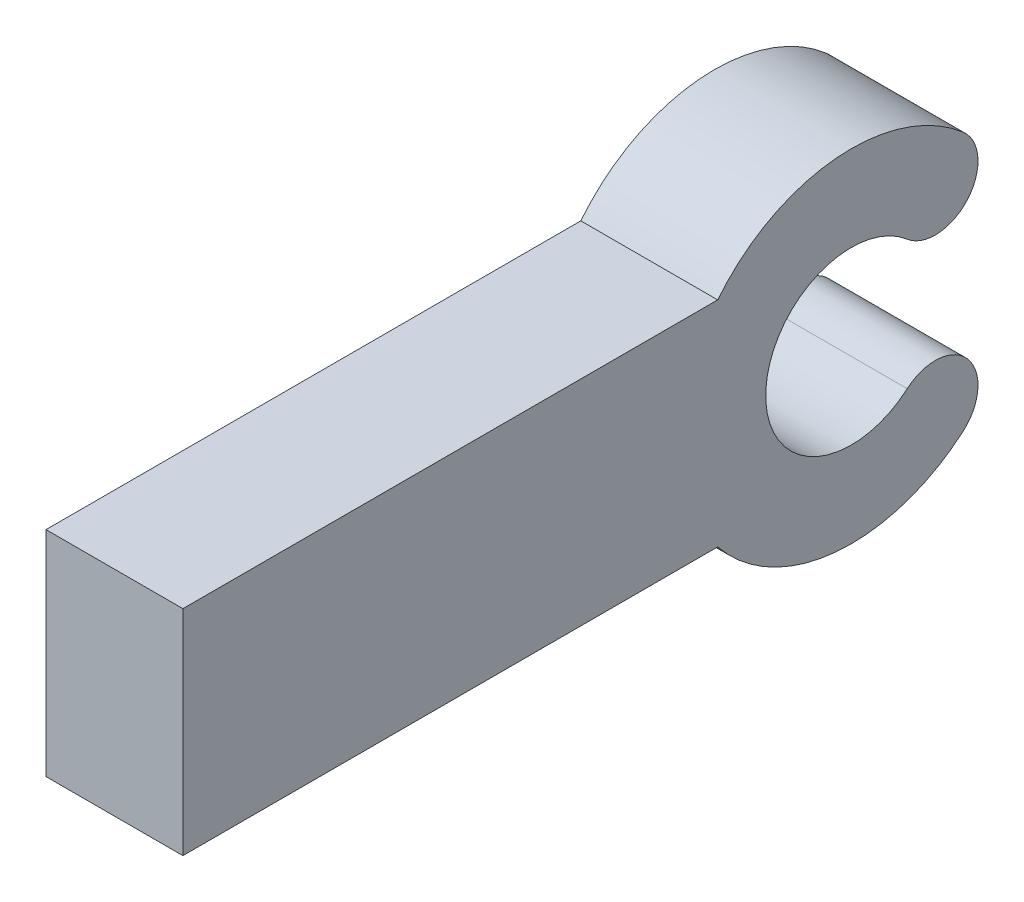
ISO-10303-21;
HEADER;
FILE_DESCRIPTION(('STEP AP214'),'2;1');
FILE_NAME('part.step','',(''),(''),'','','');
FILE_SCHEMA(('AUTOMOTIVE_DESIGN { 1 0 10303 214 1 1 1 1 }'));
ENDSEC;
DATA;
#1=APPLICATION_CONTEXT('core data for automotive mechanical design processes');
#2=APPLICATION_PROTOCOL_DEFINITION('international standard','automotive_design',2000,#1);
#3=PRODUCT_CONTEXT('',#1,'mechanical');
#4=PRODUCT('Part','Part','',(#3));
#5=PRODUCT_RELATED_PRODUCT_CATEGORY('part','',(#4));
#6=PRODUCT_DEFINITION_FORMATION('','',#4);
#7=PRODUCT_DEFINITION_CONTEXT('part definition',#1,'design');
#8=PRODUCT_DEFINITION('design','',#6,#7);
#9=PRODUCT_DEFINITION_SHAPE('','',#8);
#10=(LENGTH_UNIT() NAMED_UNIT(*) SI_UNIT(.MILLI.,.METRE.));
#11=(NAMED_UNIT(*) PLANE_ANGLE_UNIT() SI_UNIT($,.RADIAN.));
#12=(NAMED_UNIT(*) SI_UNIT($,.STERADIAN.) SOLID_ANGLE_UNIT());
#13=UNCERTAINTY_MEASURE_WITH_UNIT(LENGTH_MEASURE(1.E-05),#10,'distance_accuracy_value','');
#14=(GEOMETRIC_REPRESENTATION_CONTEXT(3) GLOBAL_UNCERTAINTY_ASSIGNED_CONTEXT((#13)) GLOBAL_UNIT_ASSIGNED_CONTEXT((#10,
#11,#12)) REPRESENTATION_CONTEXT('',''));
#15=CARTESIAN_POINT('',(0.,0.,0.));
#16=DIRECTION('',(0.,0.,1.));
#17=DIRECTION('',(1.,0.,0.));
#18=AXIS2_PLACEMENT_3D('',#15,#16,#17);
#19=CARTESIAN_POINT('',(1.6256,0.,0.));
#20=DIRECTION('',(0.,0.,-1.));
#21=DIRECTION('',(-1.,0.,0.));
#22=AXIS2_PLACEMENT_3D('',#19,#20,#21);
#23=PLANE('',#22);
#24=DIRECTION('',(0.,-1.,0.));
#25=VECTOR('',#24,1.);
#26=CARTESIAN_POINT('',(0.,0.,0.));
#27=LINE('',#26,#25);
#28=CARTESIAN_POINT('',(0.,2.54,0.));
#29=VERTEX_POINT('',#28);
#30=CARTESIAN_POINT('',(0.,0.,0.));
#31=VERTEX_POINT('',#30);
#32=EDGE_CURVE('E129',#29,#31,#27,.T.);
#33=ORIENTED_EDGE('',*,*,#32,.T.);
#34=DIRECTION('',(-1.,0.,0.));
#35=VECTOR('',#34,1.);
#36=CARTESIAN_POINT('',(1.6256,0.,0.));
#37=LINE('',#36,#35);
#38=CARTESIAN_POINT('',(1.6256,0.,0.));
#39=VERTEX_POINT('',#38);
#40=EDGE_CURVE('E11',#39,#31,#37,.T.);
#41=ORIENTED_EDGE('',*,*,#40,.F.);
#42=DIRECTION('',(0.,-1.,0.));
#43=VECTOR('',#42,1.);
#44=CARTESIAN_POINT('',(1.6256,0.,0.));
#45=LINE('',#44,#43);
#46=CARTESIAN_POINT('',(1.6256,2.54,0.));
#47=VERTEX_POINT('',#46);
#48=EDGE_CURVE('E143',#47,#39,#45,.T.);
#49=ORIENTED_EDGE('',*,*,#48,.F.);
#50=DIRECTION('',(-1.,0.,0.));
#51=VECTOR('',#50,1.);
#52=CARTESIAN_POINT('',(1.6256,2.54,0.));
#53=LINE('',#52,#51);
#54=EDGE_CURVE('E125',#47,#29,#53,.T.);
#55=ORIENTED_EDGE('',*,*,#54,.T.);
#56=EDGE_LOOP('',(#33,#41,#49,#55));
#57=FACE_BOUND('',#56,.T.);
#58=ADVANCED_FACE('F33',(#57),#23,.F.);
#59=CARTESIAN_POINT('',(1.6256,0.,0.));
#60=DIRECTION('',(0.,1.,0.));
#61=DIRECTION('',(0.,0.,1.));
#62=AXIS2_PLACEMENT_3D('',#59,#60,#61);
#63=PLANE('',#62);
#64=DIRECTION('',(0.,0.,-1.));
#65=VECTOR('',#64,1.);
#66=CARTESIAN_POINT('',(0.,0.,0.));
#67=LINE('',#66,#65);
#68=CARTESIAN_POINT('',(0.,0.,-6.35));
#69=VERTEX_POINT('',#68);
#70=EDGE_CURVE('E132',#31,#69,#67,.T.);
#71=ORIENTED_EDGE('',*,*,#70,.T.);
#72=DIRECTION('',(-1.,0.,0.));
#73=VECTOR('',#72,1.);
#74=CARTESIAN_POINT('',(1.6256,0.,-6.35));
#75=LINE('',#74,#73);
#76=CARTESIAN_POINT('',(1.6256,0.,-6.35));
#77=VERTEX_POINT('',#76);
#78=EDGE_CURVE('E41',#77,#69,#75,.T.);
#79=ORIENTED_EDGE('',*,*,#78,.F.);
#80=DIRECTION('',(0.,0.,-1.));
#81=VECTOR('',#80,1.);
#82=CARTESIAN_POINT('',(1.6256,0.,0.));
#83=LINE('',#82,#81);
#84=EDGE_CURVE('E92',#39,#77,#83,.T.);
#85=ORIENTED_EDGE('',*,*,#84,.F.);
#86=ORIENTED_EDGE('',*,*,#40,.T.);
#87=EDGE_LOOP('',(#71,#79,#85,#86));
#88=FACE_BOUND('',#87,.T.);
#89=ADVANCED_FACE('F178',(#88),#63,.F.);
#90=CARTESIAN_POINT('',(1.6256,1.27,-7.93622949159319));
#91=DIRECTION('',(-1.,0.,0.));
#92=DIRECTION('',(0.,0.,1.));
#93=AXIS2_PLACEMENT_3D('',#90,#91,#92);
#94=CYLINDRICAL_SURFACE('',#93,2.032);
#95=CARTESIAN_POINT('',(0.,1.27,-7.93622949159319));
#96=DIRECTION('',(1.,0.,0.));
#97=DIRECTION('',(0.,0.,-1.));
#98=AXIS2_PLACEMENT_3D('',#95,#96,#97);
#99=CIRCLE('',#98,2.032);
#100=CARTESIAN_POINT('',(0.,-0.267190976581902,-9.26516436641407));
#101=VERTEX_POINT('',#100);
#102=EDGE_CURVE('E134',#69,#101,#99,.T.);
#103=ORIENTED_EDGE('',*,*,#102,.T.);
#104=DIRECTION('',(-1.,0.,0.));
#105=VECTOR('',#104,1.);
#106=CARTESIAN_POINT('',(1.6256,-0.267190976581902,-9.26516436641407));
#107=LINE('',#106,#105);
#108=CARTESIAN_POINT('',(1.6256,-0.267190976581902,-9.26516436641407));
#109=VERTEX_POINT('',#108);
#110=EDGE_CURVE('E150',#109,#101,#107,.T.);
#111=ORIENTED_EDGE('',*,*,#110,.F.);
#112=CARTESIAN_POINT('',(1.6256,1.27,-7.93622949159319));
#113=DIRECTION('',(1.,0.,0.));
#114=DIRECTION('',(0.,0.,-1.));
#115=AXIS2_PLACEMENT_3D('',#112,#113,#114);
#116=CIRCLE('',#115,2.032);
#117=EDGE_CURVE('E158',#77,#109,#116,.T.);
#118=ORIENTED_EDGE('',*,*,#117,.F.);
#119=ORIENTED_EDGE('',*,*,#78,.T.);
#120=EDGE_LOOP('',(#103,#111,#118,#119));
#121=FACE_BOUND('',#120,.T.);
#122=ADVANCED_FACE('F156',(#121),#94,.T.);
#123=CARTESIAN_POINT('',(1.6256,0.117106767563573,-8.93293064770885));
#124=DIRECTION('',(-1.,0.,0.));
#125=DIRECTION('',(0.,0.,1.));
#126=AXIS2_PLACEMENT_3D('',#123,#124,#125);
#127=CYLINDRICAL_SURFACE('',#126,0.508);
#128=CARTESIAN_POINT('',(0.,0.117106767563573,-8.93293064770885));
#129=DIRECTION('',(1.,0.,0.));
#130=DIRECTION('',(0.,0.,1.));
#131=AXIS2_PLACEMENT_3D('',#128,#129,#130);
#132=CIRCLE('',#131,0.508);
#133=CARTESIAN_POINT('',(0.,0.501404511709048,-8.60069692900363));
#134=VERTEX_POINT('',#133);
#135=EDGE_CURVE('E136',#101,#134,#132,.T.);
#136=ORIENTED_EDGE('',*,*,#135,.T.);
#137=DIRECTION('',(-1.,0.,0.));
#138=VECTOR('',#137,1.);
#139=CARTESIAN_POINT('',(1.6256,0.501404511709048,-8.60069692900363));
#140=LINE('',#139,#138);
#141=CARTESIAN_POINT('',(1.6256,0.501404511709048,-8.60069692900363));
#142=VERTEX_POINT('',#141);
#143=EDGE_CURVE('E147',#142,#134,#140,.T.);
#144=ORIENTED_EDGE('',*,*,#143,.F.);
#145=CARTESIAN_POINT('',(1.6256,0.117106767563573,-8.93293064770885));
#146=DIRECTION('',(1.,0.,0.));
#147=DIRECTION('',(0.,0.,1.));
#148=AXIS2_PLACEMENT_3D('',#145,#146,#147);
#149=CIRCLE('',#148,0.508);
#150=EDGE_CURVE('E170',#109,#142,#149,.T.);
#151=ORIENTED_EDGE('',*,*,#150,.F.);
#152=ORIENTED_EDGE('',*,*,#110,.T.);
#153=EDGE_LOOP('',(#136,#144,#151,#152));
#154=FACE_BOUND('',#153,.T.);
#155=ADVANCED_FACE('F166',(#154),#127,.T.);
#156=CARTESIAN_POINT('',(1.6256,1.27,-7.93622949159319));
#157=DIRECTION('',(-1.,0.,0.));
#158=DIRECTION('',(0.,0.,1.));
#159=AXIS2_PLACEMENT_3D('',#156,#157,#158);
#160=CYLINDRICAL_SURFACE('',#159,1.016);
#161=CARTESIAN_POINT('',(0.,1.27,-7.93622949159319));
#162=DIRECTION('',(-1.,0.,0.));
#163=DIRECTION('',(0.,0.,-1.));
#164=AXIS2_PLACEMENT_3D('',#161,#162,#163);
#165=CIRCLE('',#164,1.016);
#166=CARTESIAN_POINT('',(0.,2.03859548829095,-8.60069692900363));
#167=VERTEX_POINT('',#166);
#168=EDGE_CURVE('E138',#134,#167,#165,.T.);
#169=ORIENTED_EDGE('',*,*,#168,.T.);
#170=DIRECTION('',(-1.,0.,0.));
#171=VECTOR('',#170,1.);
#172=CARTESIAN_POINT('',(1.6256,2.03859548829095,-8.60069692900363));
#173=LINE('',#172,#171);
#174=CARTESIAN_POINT('',(1.6256,2.03859548829095,-8.60069692900363));
#175=VERTEX_POINT('',#174);
#176=EDGE_CURVE('E120',#175,#167,#173,.T.);
#177=ORIENTED_EDGE('',*,*,#176,.F.);
#178=CARTESIAN_POINT('',(1.6256,1.27,-7.93622949159319));
#179=DIRECTION('',(-1.,0.,0.));
#180=DIRECTION('',(0.,0.,-1.));
#181=AXIS2_PLACEMENT_3D('',#178,#179,#180);
#182=CIRCLE('',#181,1.016);
#183=EDGE_CURVE('E111',#142,#175,#182,.T.);
#184=ORIENTED_EDGE('',*,*,#183,.F.);
#185=ORIENTED_EDGE('',*,*,#143,.T.);
#186=EDGE_LOOP('',(#169,#177,#184,#185));
#187=FACE_BOUND('',#186,.T.);
#188=ADVANCED_FACE('F169',(#187),#160,.F.);
#189=CARTESIAN_POINT('',(1.6256,2.42289323243643,-8.93293064770885));
#190=DIRECTION('',(-1.,0.,0.));
#191=DIRECTION('',(0.,0.,1.));
#192=AXIS2_PLACEMENT_3D('',#189,#190,#191);
#193=CYLINDRICAL_SURFACE('',#192,0.508);
#194=CARTESIAN_POINT('',(0.,2.42289323243643,-8.93293064770885));
#195=DIRECTION('',(1.,0.,0.));
#196=DIRECTION('',(0.,0.,1.));
#197=AXIS2_PLACEMENT_3D('',#194,#195,#196);
#198=CIRCLE('',#197,0.508);
#199=CARTESIAN_POINT('',(0.,2.8071909765819,-9.26516436641407));
#200=VERTEX_POINT('',#199);
#201=EDGE_CURVE('E119',#167,#200,#198,.T.);
#202=ORIENTED_EDGE('',*,*,#201,.T.);
#203=DIRECTION('',(-1.,0.,0.));
#204=VECTOR('',#203,1.);
#205=CARTESIAN_POINT('',(1.6256,2.8071909765819,-9.26516436641407));
#206=LINE('',#205,#204);
#207=CARTESIAN_POINT('',(1.6256,2.8071909765819,-9.26516436641407));
#208=VERTEX_POINT('',#207);
#209=EDGE_CURVE('E116',#208,#200,#206,.T.);
#210=ORIENTED_EDGE('',*,*,#209,.F.);
#211=CARTESIAN_POINT('',(1.6256,2.42289323243643,-8.93293064770885));
#212=DIRECTION('',(1.,0.,0.));
#213=DIRECTION('',(0.,0.,1.));
#214=AXIS2_PLACEMENT_3D('',#211,#212,#213);
#215=CIRCLE('',#214,0.508);
#216=EDGE_CURVE('E105',#175,#208,#215,.T.);
#217=ORIENTED_EDGE('',*,*,#216,.F.);
#218=ORIENTED_EDGE('',*,*,#176,.T.);
#219=EDGE_LOOP('',(#202,#210,#217,#218));
#220=FACE_BOUND('',#219,.T.);
#221=ADVANCED_FACE('F117',(#220),#193,.T.);
#222=CARTESIAN_POINT('',(1.6256,1.27,-7.93622949159319));
#223=DIRECTION('',(-1.,0.,0.));
#224=DIRECTION('',(0.,0.,1.));
#225=AXIS2_PLACEMENT_3D('',#222,#223,#224);
#226=CYLINDRICAL_SURFACE('',#225,2.032);
#227=CARTESIAN_POINT('',(0.,1.27,-7.93622949159319));
#228=DIRECTION('',(1.,0.,0.));
#229=DIRECTION('',(0.,0.,-1.));
#230=AXIS2_PLACEMENT_3D('',#227,#228,#229);
#231=CIRCLE('',#230,2.032);
#232=CARTESIAN_POINT('',(0.,2.54,-6.35));
#233=VERTEX_POINT('',#232);
#234=EDGE_CURVE('E78',#200,#233,#231,.T.);
#235=ORIENTED_EDGE('',*,*,#234,.T.);
#236=DIRECTION('',(-1.,0.,0.));
#237=VECTOR('',#236,1.);
#238=CARTESIAN_POINT('',(1.6256,2.54,-6.35));
#239=LINE('',#238,#237);
#240=CARTESIAN_POINT('',(1.6256,2.54,-6.35));
#241=VERTEX_POINT('',#240);
#242=EDGE_CURVE('E121',#241,#233,#239,.T.);
#243=ORIENTED_EDGE('',*,*,#242,.F.);
#244=CARTESIAN_POINT('',(1.6256,1.27,-7.93622949159319));
#245=DIRECTION('',(1.,0.,0.));
#246=DIRECTION('',(0.,0.,-1.));
#247=AXIS2_PLACEMENT_3D('',#244,#245,#246);
#248=CIRCLE('',#247,2.032);
#249=EDGE_CURVE('E109',#208,#241,#248,.T.);
#250=ORIENTED_EDGE('',*,*,#249,.F.);
#251=ORIENTED_EDGE('',*,*,#209,.T.);
#252=EDGE_LOOP('',(#235,#243,#250,#251));
#253=FACE_BOUND('',#252,.T.);
#254=ADVANCED_FACE('F123',(#253),#226,.T.);
#255=CARTESIAN_POINT('',(1.6256,2.54,0.));
#256=DIRECTION('',(0.,-1.,0.));
#257=DIRECTION('',(0.,0.,-1.));
#258=AXIS2_PLACEMENT_3D('',#255,#256,#257);
#259=PLANE('',#258);
#260=DIRECTION('',(0.,0.,1.));
#261=VECTOR('',#260,1.);
#262=CARTESIAN_POINT('',(0.,2.54,0.));
#263=LINE('',#262,#261);
#264=EDGE_CURVE('E84',#233,#29,#263,.T.);
#265=ORIENTED_EDGE('',*,*,#264,.T.);
#266=ORIENTED_EDGE('',*,*,#54,.F.);
#267=DIRECTION('',(0.,0.,1.));
#268=VECTOR('',#267,1.);
#269=CARTESIAN_POINT('',(1.6256,2.54,0.));
#270=LINE('',#269,#268);
#271=EDGE_CURVE('E49',#241,#47,#270,.T.);
#272=ORIENTED_EDGE('',*,*,#271,.F.);
#273=ORIENTED_EDGE('',*,*,#242,.T.);
#274=EDGE_LOOP('',(#265,#266,#272,#273));
#275=FACE_BOUND('',#274,.T.);
#276=ADVANCED_FACE('F194',(#275),#259,.F.);
#277=CARTESIAN_POINT('',(1.6256,1.27,-7.93622949159319));
#278=DIRECTION('',(1.,0.,0.));
#279=DIRECTION('',(0.,0.,-1.));
#280=AXIS2_PLACEMENT_3D('',#277,#278,#279);
#281=PLANE('',#280);
#282=ORIENTED_EDGE('',*,*,#48,.T.);
#283=ORIENTED_EDGE('',*,*,#84,.T.);
#284=ORIENTED_EDGE('',*,*,#117,.T.);
#285=ORIENTED_EDGE('',*,*,#150,.T.);
#286=ORIENTED_EDGE('',*,*,#183,.T.);
#287=ORIENTED_EDGE('',*,*,#216,.T.);
#288=ORIENTED_EDGE('',*,*,#249,.T.);
#289=ORIENTED_EDGE('',*,*,#271,.T.);
#290=EDGE_LOOP('',(#282,#283,#284,#285,#286,#287,#288,#289));
#291=FACE_BOUND('',#290,.T.);
#292=ADVANCED_FACE('F107',(#291),#281,.T.);
#293=CARTESIAN_POINT('',(0.,1.27,-7.93622949159319));
#294=DIRECTION('',(1.,0.,0.));
#295=DIRECTION('',(0.,0.,-1.));
#296=AXIS2_PLACEMENT_3D('',#293,#294,#295);
#297=PLANE('',#296);
#298=ORIENTED_EDGE('',*,*,#32,.F.);
#299=ORIENTED_EDGE('',*,*,#264,.F.);
#300=ORIENTED_EDGE('',*,*,#234,.F.);
#301=ORIENTED_EDGE('',*,*,#201,.F.);
#302=ORIENTED_EDGE('',*,*,#168,.F.);
#303=ORIENTED_EDGE('',*,*,#135,.F.);
#304=ORIENTED_EDGE('',*,*,#102,.F.);
#305=ORIENTED_EDGE('',*,*,#70,.F.);
#306=EDGE_LOOP('',(#298,#299,#300,#301,#302,#303,#304,#305));
#307=FACE_BOUND('',#306,.T.);
#308=ADVANCED_FACE('F162',(#307),#297,.F.);
#309=CLOSED_SHELL('',(#58,#89,#122,#155,#188,#221,#254,#276,#292,#308));
#310=MANIFOLD_SOLID_BREP('B2',#309);
#311=ADVANCED_BREP_SHAPE_REPRESENTATION('',(#18,#310),#14);
#312=SHAPE_DEFINITION_REPRESENTATION(#9,#311);
ENDSEC;
END-ISO-10303-21;
